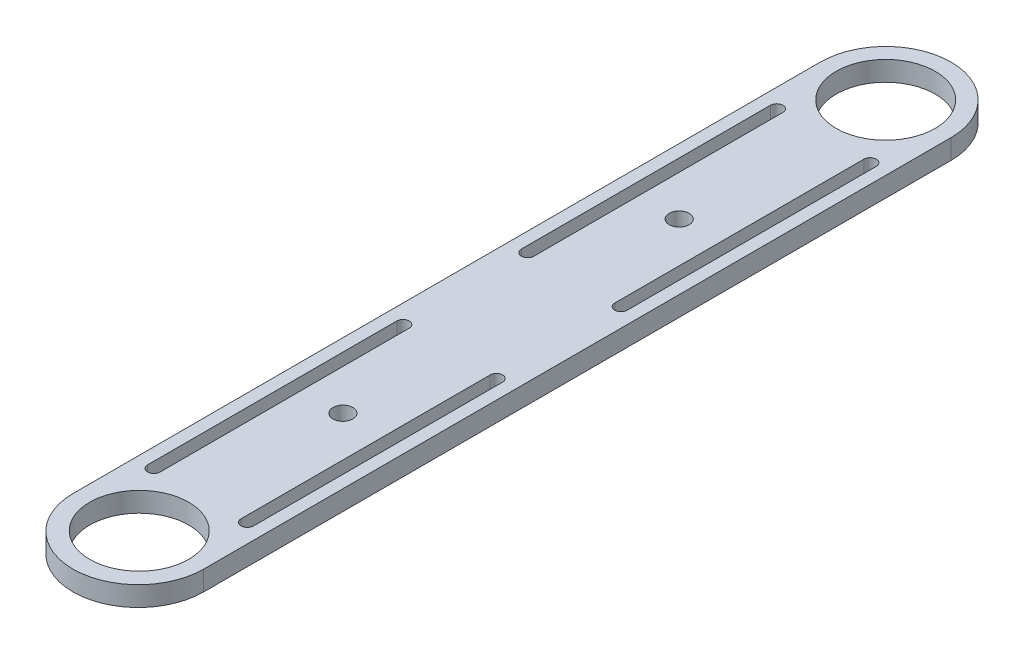
ISO-10303-21;
HEADER;
FILE_DESCRIPTION(('STEP AP214'),'2;1');
FILE_NAME('part.step','',(''),(''),'','','');
FILE_SCHEMA(('AUTOMOTIVE_DESIGN { 1 0 10303 214 1 1 1 1 }'));
ENDSEC;
DATA;
#1=APPLICATION_CONTEXT('core data for automotive mechanical design processes');
#2=APPLICATION_PROTOCOL_DEFINITION('international standard','automotive_design',2000,#1);
#3=PRODUCT_CONTEXT('',#1,'mechanical');
#4=PRODUCT('Part','Part','',(#3));
#5=PRODUCT_RELATED_PRODUCT_CATEGORY('part','',(#4));
#6=PRODUCT_DEFINITION_FORMATION('','',#4);
#7=PRODUCT_DEFINITION_CONTEXT('part definition',#1,'design');
#8=PRODUCT_DEFINITION('design','',#6,#7);
#9=PRODUCT_DEFINITION_SHAPE('','',#8);
#10=(LENGTH_UNIT() NAMED_UNIT(*) SI_UNIT(.MILLI.,.METRE.));
#11=(NAMED_UNIT(*) PLANE_ANGLE_UNIT() SI_UNIT($,.RADIAN.));
#12=(NAMED_UNIT(*) SI_UNIT($,.STERADIAN.) SOLID_ANGLE_UNIT());
#13=UNCERTAINTY_MEASURE_WITH_UNIT(LENGTH_MEASURE(1.E-05),#10,'distance_accuracy_value','');
#14=(GEOMETRIC_REPRESENTATION_CONTEXT(3) GLOBAL_UNCERTAINTY_ASSIGNED_CONTEXT((#13)) GLOBAL_UNIT_ASSIGNED_CONTEXT((#10,
#11,#12)) REPRESENTATION_CONTEXT('',''));
#15=CARTESIAN_POINT('',(0.,0.,0.));
#16=DIRECTION('',(0.,0.,1.));
#17=DIRECTION('',(1.,0.,0.));
#18=AXIS2_PLACEMENT_3D('',#15,#16,#17);
#19=CARTESIAN_POINT('',(0.,3.175,0.));
#20=DIRECTION('',(0.,-1.,0.));
#21=DIRECTION('',(0.,0.,-1.));
#22=AXIS2_PLACEMENT_3D('',#19,#20,#21);
#23=CYLINDRICAL_SURFACE('',#22,10.5);
#24=CARTESIAN_POINT('',(0.,0.,0.));
#25=DIRECTION('',(0.,1.,0.));
#26=DIRECTION('',(0.,0.,1.));
#27=AXIS2_PLACEMENT_3D('',#24,#25,#26);
#28=CIRCLE('',#27,10.5);
#29=CARTESIAN_POINT('',(10.5,0.,0.));
#30=VERTEX_POINT('',#29);
#31=CARTESIAN_POINT('',(-10.5,0.,0.));
#32=VERTEX_POINT('',#31);
#33=EDGE_CURVE('E273',#30,#32,#28,.T.);
#34=ORIENTED_EDGE('',*,*,#33,.T.);
#35=DIRECTION('',(0.,-1.,0.));
#36=VECTOR('',#35,1.);
#37=CARTESIAN_POINT('',(-10.5,3.175,0.));
#38=LINE('',#37,#36);
#39=CARTESIAN_POINT('',(-10.5,3.175,0.));
#40=VERTEX_POINT('',#39);
#41=EDGE_CURVE('E302',#40,#32,#38,.T.);
#42=ORIENTED_EDGE('',*,*,#41,.F.);
#43=CARTESIAN_POINT('',(0.,3.175,0.));
#44=DIRECTION('',(0.,1.,0.));
#45=DIRECTION('',(0.,0.,1.));
#46=AXIS2_PLACEMENT_3D('',#43,#44,#45);
#47=CIRCLE('',#46,10.5);
#48=CARTESIAN_POINT('',(10.5,3.175,0.));
#49=VERTEX_POINT('',#48);
#50=EDGE_CURVE('E276',#49,#40,#47,.T.);
#51=ORIENTED_EDGE('',*,*,#50,.F.);
#52=DIRECTION('',(0.,-1.,0.));
#53=VECTOR('',#52,1.);
#54=CARTESIAN_POINT('',(10.5,3.175,0.));
#55=LINE('',#54,#53);
#56=EDGE_CURVE('E286',#49,#30,#55,.T.);
#57=ORIENTED_EDGE('',*,*,#56,.T.);
#58=EDGE_LOOP('',(#34,#42,#51,#57));
#59=FACE_BOUND('',#58,.T.);
#60=ADVANCED_FACE('F33',(#59),#23,.T.);
#61=CARTESIAN_POINT('',(-10.5,3.175,0.));
#62=DIRECTION('',(1.,0.,0.));
#63=DIRECTION('',(0.,0.,-1.));
#64=AXIS2_PLACEMENT_3D('',#61,#62,#63);
#65=PLANE('',#64);
#66=DIRECTION('',(0.,0.,1.));
#67=VECTOR('',#66,1.);
#68=CARTESIAN_POINT('',(-10.5,0.,0.));
#69=LINE('',#68,#67);
#70=CARTESIAN_POINT('',(-10.5,0.,120.));
#71=VERTEX_POINT('',#70);
#72=EDGE_CURVE('E289',#32,#71,#69,.T.);
#73=ORIENTED_EDGE('',*,*,#72,.T.);
#74=DIRECTION('',(0.,-1.,0.));
#75=VECTOR('',#74,1.);
#76=CARTESIAN_POINT('',(-10.5,3.175,120.));
#77=LINE('',#76,#75);
#78=CARTESIAN_POINT('',(-10.5,3.175,120.));
#79=VERTEX_POINT('',#78);
#80=EDGE_CURVE('E299',#79,#71,#77,.T.);
#81=ORIENTED_EDGE('',*,*,#80,.F.);
#82=DIRECTION('',(0.,0.,1.));
#83=VECTOR('',#82,1.);
#84=CARTESIAN_POINT('',(-10.5,3.175,0.));
#85=LINE('',#84,#83);
#86=EDGE_CURVE('E279',#40,#79,#85,.T.);
#87=ORIENTED_EDGE('',*,*,#86,.F.);
#88=ORIENTED_EDGE('',*,*,#41,.T.);
#89=EDGE_LOOP('',(#73,#81,#87,#88));
#90=FACE_BOUND('',#89,.T.);
#91=ADVANCED_FACE('F368',(#90),#65,.F.);
#92=CARTESIAN_POINT('',(0.,3.175,120.));
#93=DIRECTION('',(0.,-1.,0.));
#94=DIRECTION('',(0.,0.,-1.));
#95=AXIS2_PLACEMENT_3D('',#92,#93,#94);
#96=CYLINDRICAL_SURFACE('',#95,10.5);
#97=CARTESIAN_POINT('',(0.,0.,120.));
#98=DIRECTION('',(0.,1.,0.));
#99=DIRECTION('',(0.,0.,1.));
#100=AXIS2_PLACEMENT_3D('',#97,#98,#99);
#101=CIRCLE('',#100,10.5);
#102=CARTESIAN_POINT('',(10.5,0.,120.));
#103=VERTEX_POINT('',#102);
#104=EDGE_CURVE('E291',#71,#103,#101,.T.);
#105=ORIENTED_EDGE('',*,*,#104,.T.);
#106=DIRECTION('',(0.,-1.,0.));
#107=VECTOR('',#106,1.);
#108=CARTESIAN_POINT('',(10.5,3.175,120.));
#109=LINE('',#108,#107);
#110=CARTESIAN_POINT('',(10.5,3.175,120.));
#111=VERTEX_POINT('',#110);
#112=EDGE_CURVE('E296',#111,#103,#109,.T.);
#113=ORIENTED_EDGE('',*,*,#112,.F.);
#114=CARTESIAN_POINT('',(0.,3.175,120.));
#115=DIRECTION('',(0.,1.,0.));
#116=DIRECTION('',(0.,0.,1.));
#117=AXIS2_PLACEMENT_3D('',#114,#115,#116);
#118=CIRCLE('',#117,10.5);
#119=EDGE_CURVE('E282',#79,#111,#118,.T.);
#120=ORIENTED_EDGE('',*,*,#119,.F.);
#121=ORIENTED_EDGE('',*,*,#80,.T.);
#122=EDGE_LOOP('',(#105,#113,#120,#121));
#123=FACE_BOUND('',#122,.T.);
#124=ADVANCED_FACE('F373',(#123),#96,.T.);
#125=CARTESIAN_POINT('',(10.5,3.175,0.));
#126=DIRECTION('',(-1.,0.,0.));
#127=DIRECTION('',(0.,0.,1.));
#128=AXIS2_PLACEMENT_3D('',#125,#126,#127);
#129=PLANE('',#128);
#130=DIRECTION('',(0.,0.,-1.));
#131=VECTOR('',#130,1.);
#132=CARTESIAN_POINT('',(10.5,0.,0.));
#133=LINE('',#132,#131);
#134=EDGE_CURVE('E280',#103,#30,#133,.T.);
#135=ORIENTED_EDGE('',*,*,#134,.T.);
#136=ORIENTED_EDGE('',*,*,#56,.F.);
#137=DIRECTION('',(0.,0.,-1.));
#138=VECTOR('',#137,1.);
#139=CARTESIAN_POINT('',(10.5,3.175,0.));
#140=LINE('',#139,#138);
#141=EDGE_CURVE('E284',#111,#49,#140,.T.);
#142=ORIENTED_EDGE('',*,*,#141,.F.);
#143=ORIENTED_EDGE('',*,*,#112,.T.);
#144=EDGE_LOOP('',(#135,#136,#142,#143));
#145=FACE_BOUND('',#144,.T.);
#146=ADVANCED_FACE('F388',(#145),#129,.F.);
#147=CARTESIAN_POINT('',(0.,3.175,0.));
#148=DIRECTION('',(0.,1.,0.));
#149=DIRECTION('',(0.,0.,1.));
#150=AXIS2_PLACEMENT_3D('',#147,#148,#149);
#151=PLANE('',#150);
#152=CARTESIAN_POINT('',(0.,3.175,0.));
#153=DIRECTION('',(0.,1.,0.));
#154=DIRECTION('',(0.,0.,1.));
#155=AXIS2_PLACEMENT_3D('',#152,#153,#154);
#156=CIRCLE('',#155,7.95);
#157=CARTESIAN_POINT('',(0.,3.175,7.94999999999997));
#158=VERTEX_POINT('',#157);
#159=EDGE_CURVE('E486',#158,#158,#156,.T.);
#160=ORIENTED_EDGE('',*,*,#159,.F.);
#161=EDGE_LOOP('',(#160));
#162=FACE_BOUND('',#161,.T.);
#163=CARTESIAN_POINT('',(-0.0032230352220719,3.175,119.850034656661));
#164=DIRECTION('',(0.,1.,0.));
#165=DIRECTION('',(0.,0.,1.));
#166=AXIS2_PLACEMENT_3D('',#163,#164,#165);
#167=CIRCLE('',#166,7.95);
#168=CARTESIAN_POINT('',(-0.0032230352220719,3.175,127.800034656661));
#169=VERTEX_POINT('',#168);
#170=EDGE_CURVE('E490',#169,#169,#167,.T.);
#171=ORIENTED_EDGE('',*,*,#170,.F.);
#172=EDGE_LOOP('',(#171));
#173=FACE_BOUND('',#172,.T.);
#174=CARTESIAN_POINT('',(0.,3.175,33.1500000000001));
#175=DIRECTION('',(0.,1.,0.));
#176=DIRECTION('',(0.,0.,1.));
#177=AXIS2_PLACEMENT_3D('',#174,#175,#176);
#178=CIRCLE('',#177,1.6);
#179=CARTESIAN_POINT('',(0.,3.175,34.7500000000001));
#180=VERTEX_POINT('',#179);
#181=EDGE_CURVE('E206',#180,#180,#178,.T.);
#182=ORIENTED_EDGE('',*,*,#181,.F.);
#183=EDGE_LOOP('',(#182));
#184=FACE_BOUND('',#183,.T.);
#185=CARTESIAN_POINT('',(0.,3.175,87.1500000000001));
#186=DIRECTION('',(0.,1.,0.));
#187=DIRECTION('',(0.,0.,1.));
#188=AXIS2_PLACEMENT_3D('',#185,#186,#187);
#189=CIRCLE('',#188,1.59999999999999);
#190=CARTESIAN_POINT('',(0.,3.175,88.7500000000001));
#191=VERTEX_POINT('',#190);
#192=EDGE_CURVE('E503',#191,#191,#189,.T.);
#193=ORIENTED_EDGE('',*,*,#192,.F.);
#194=EDGE_LOOP('',(#193));
#195=FACE_BOUND('',#194,.T.);
#196=CARTESIAN_POINT('',(-7.50000000000003,3.175,50.));
#197=DIRECTION('',(0.,-1.,0.));
#198=DIRECTION('',(0.,0.,-1.));
#199=AXIS2_PLACEMENT_3D('',#196,#197,#198);
#200=CIRCLE('',#199,0.999999999999999);
#201=CARTESIAN_POINT('',(-6.50000000000003,3.175,50.));
#202=VERTEX_POINT('',#201);
#203=CARTESIAN_POINT('',(-8.50000000000002,3.175,50.));
#204=VERTEX_POINT('',#203);
#205=EDGE_CURVE('E238',#202,#204,#200,.T.);
#206=ORIENTED_EDGE('',*,*,#205,.T.);
#207=DIRECTION('',(0.,0.,-1.));
#208=VECTOR('',#207,1.);
#209=CARTESIAN_POINT('',(-8.50000000000002,3.175,50.));
#210=LINE('',#209,#208);
#211=CARTESIAN_POINT('',(-8.50000000000002,3.175,10.));
#212=VERTEX_POINT('',#211);
#213=EDGE_CURVE('E241',#204,#212,#210,.T.);
#214=ORIENTED_EDGE('',*,*,#213,.T.);
#215=CARTESIAN_POINT('',(-7.50000000000003,3.175,10.));
#216=DIRECTION('',(0.,-1.,0.));
#217=DIRECTION('',(0.,0.,-1.));
#218=AXIS2_PLACEMENT_3D('',#215,#216,#217);
#219=CIRCLE('',#218,0.999999999999999);
#220=CARTESIAN_POINT('',(-6.50000000000003,3.175,10.));
#221=VERTEX_POINT('',#220);
#222=EDGE_CURVE('E49',#212,#221,#219,.T.);
#223=ORIENTED_EDGE('',*,*,#222,.T.);
#224=DIRECTION('',(0.,0.,1.));
#225=VECTOR('',#224,1.);
#226=CARTESIAN_POINT('',(-6.50000000000003,3.175,10.));
#227=LINE('',#226,#225);
#228=EDGE_CURVE('E245',#221,#202,#227,.T.);
#229=ORIENTED_EDGE('',*,*,#228,.T.);
#230=EDGE_LOOP('',(#206,#214,#223,#229));
#231=FACE_BOUND('',#230,.T.);
#232=CARTESIAN_POINT('',(7.49999999999997,3.175,10.));
#233=DIRECTION('',(0.,-1.,0.));
#234=DIRECTION('',(0.,0.,-1.));
#235=AXIS2_PLACEMENT_3D('',#232,#233,#234);
#236=CIRCLE('',#235,0.999999999999997);
#237=CARTESIAN_POINT('',(6.49999999999997,3.175,10.));
#238=VERTEX_POINT('',#237);
#239=CARTESIAN_POINT('',(8.49999999999997,3.175,10.));
#240=VERTEX_POINT('',#239);
#241=EDGE_CURVE('E218',#238,#240,#236,.T.);
#242=ORIENTED_EDGE('',*,*,#241,.T.);
#243=DIRECTION('',(0.,0.,1.));
#244=VECTOR('',#243,1.);
#245=CARTESIAN_POINT('',(8.49999999999997,3.175,10.));
#246=LINE('',#245,#244);
#247=CARTESIAN_POINT('',(8.49999999999997,3.175,50.));
#248=VERTEX_POINT('',#247);
#249=EDGE_CURVE('E221',#240,#248,#246,.T.);
#250=ORIENTED_EDGE('',*,*,#249,.T.);
#251=CARTESIAN_POINT('',(7.49999999999997,3.175,50.));
#252=DIRECTION('',(0.,-1.,0.));
#253=DIRECTION('',(0.,0.,-1.));
#254=AXIS2_PLACEMENT_3D('',#251,#252,#253);
#255=CIRCLE('',#254,0.999999999999999);
#256=CARTESIAN_POINT('',(6.49999999999997,3.175,50.));
#257=VERTEX_POINT('',#256);
#258=EDGE_CURVE('E225',#248,#257,#255,.T.);
#259=ORIENTED_EDGE('',*,*,#258,.T.);
#260=DIRECTION('',(0.,0.,-1.));
#261=VECTOR('',#260,1.);
#262=CARTESIAN_POINT('',(6.49999999999997,3.175,50.));
#263=LINE('',#262,#261);
#264=EDGE_CURVE('E228',#257,#238,#263,.T.);
#265=ORIENTED_EDGE('',*,*,#264,.T.);
#266=EDGE_LOOP('',(#242,#250,#259,#265));
#267=FACE_BOUND('',#266,.T.);
#268=CARTESIAN_POINT('',(7.49999999999984,3.175,110.));
#269=DIRECTION('',(0.,-1.,0.));
#270=DIRECTION('',(0.,0.,-1.));
#271=AXIS2_PLACEMENT_3D('',#268,#269,#270);
#272=CIRCLE('',#271,0.999999999999999);
#273=CARTESIAN_POINT('',(8.49999999999997,3.175,110.));
#274=VERTEX_POINT('',#273);
#275=CARTESIAN_POINT('',(6.49999999999997,3.175,110.));
#276=VERTEX_POINT('',#275);
#277=EDGE_CURVE('E179',#274,#276,#272,.T.);
#278=ORIENTED_EDGE('',*,*,#277,.T.);
#279=DIRECTION('',(0.,0.,-1.));
#280=VECTOR('',#279,1.);
#281=CARTESIAN_POINT('',(6.49999999999997,3.175,110.));
#282=LINE('',#281,#280);
#283=CARTESIAN_POINT('',(6.49999999999994,3.175,70.));
#284=VERTEX_POINT('',#283);
#285=EDGE_CURVE('E190',#276,#284,#282,.T.);
#286=ORIENTED_EDGE('',*,*,#285,.T.);
#287=CARTESIAN_POINT('',(7.49999999999994,3.175,70.0000000000001));
#288=DIRECTION('',(0.,-1.,0.));
#289=DIRECTION('',(0.,0.,-1.));
#290=AXIS2_PLACEMENT_3D('',#287,#288,#289);
#291=CIRCLE('',#290,1.00000000000001);
#292=CARTESIAN_POINT('',(8.49999999999997,3.175,70.));
#293=VERTEX_POINT('',#292);
#294=EDGE_CURVE('E195',#284,#293,#291,.T.);
#295=ORIENTED_EDGE('',*,*,#294,.T.);
#296=DIRECTION('',(0.,0.,1.));
#297=VECTOR('',#296,1.);
#298=CARTESIAN_POINT('',(8.49999999999997,3.175,70.));
#299=LINE('',#298,#297);
#300=EDGE_CURVE('E186',#293,#274,#299,.T.);
#301=ORIENTED_EDGE('',*,*,#300,.T.);
#302=EDGE_LOOP('',(#278,#286,#295,#301));
#303=FACE_BOUND('',#302,.T.);
#304=CARTESIAN_POINT('',(-7.50000000000005,3.175,70.));
#305=DIRECTION('',(0.,-1.,0.));
#306=DIRECTION('',(0.,0.,-1.));
#307=AXIS2_PLACEMENT_3D('',#304,#305,#306);
#308=CIRCLE('',#307,0.999999999999999);
#309=CARTESIAN_POINT('',(-8.50000000000002,3.175,70.));
#310=VERTEX_POINT('',#309);
#311=CARTESIAN_POINT('',(-6.50000000000003,3.175,70.));
#312=VERTEX_POINT('',#311);
#313=EDGE_CURVE('E215',#310,#312,#308,.T.);
#314=ORIENTED_EDGE('',*,*,#313,.T.);
#315=DIRECTION('',(0.,0.,1.));
#316=VECTOR('',#315,1.);
#317=CARTESIAN_POINT('',(-6.50000000000003,3.175,70.));
#318=LINE('',#317,#316);
#319=CARTESIAN_POINT('',(-6.50000000000003,3.175,110.));
#320=VERTEX_POINT('',#319);
#321=EDGE_CURVE('E258',#312,#320,#318,.T.);
#322=ORIENTED_EDGE('',*,*,#321,.T.);
#323=CARTESIAN_POINT('',(-7.50000000000016,3.175,110.));
#324=DIRECTION('',(0.,-1.,0.));
#325=DIRECTION('',(0.,0.,-1.));
#326=AXIS2_PLACEMENT_3D('',#323,#324,#325);
#327=CIRCLE('',#326,1.00000000000007);
#328=CARTESIAN_POINT('',(-8.50000000000016,3.175,110.));
#329=VERTEX_POINT('',#328);
#330=EDGE_CURVE('E113',#320,#329,#327,.T.);
#331=ORIENTED_EDGE('',*,*,#330,.T.);
#332=DIRECTION('',(0.,0.,-1.));
#333=VECTOR('',#332,1.);
#334=CARTESIAN_POINT('',(-8.50000000000016,3.175,110.));
#335=LINE('',#334,#333);
#336=EDGE_CURVE('E262',#329,#310,#335,.T.);
#337=ORIENTED_EDGE('',*,*,#336,.T.);
#338=EDGE_LOOP('',(#314,#322,#331,#337));
#339=FACE_BOUND('',#338,.T.);
#340=ORIENTED_EDGE('',*,*,#50,.T.);
#341=ORIENTED_EDGE('',*,*,#86,.T.);
#342=ORIENTED_EDGE('',*,*,#119,.T.);
#343=ORIENTED_EDGE('',*,*,#141,.T.);
#344=EDGE_LOOP('',(#340,#341,#342,#343));
#345=FACE_BOUND('',#344,.T.);
#346=ADVANCED_FACE('F197',(#162,#173,#184,#195,#231,#267,#303,#339,#345),#151,.T.);
#347=CARTESIAN_POINT('',(0.,0.,0.));
#348=DIRECTION('',(0.,1.,0.));
#349=DIRECTION('',(0.,0.,1.));
#350=AXIS2_PLACEMENT_3D('',#347,#348,#349);
#351=PLANE('',#350);
#352=CARTESIAN_POINT('',(0.,0.,0.));
#353=DIRECTION('',(0.,1.,0.));
#354=DIRECTION('',(0.,0.,1.));
#355=AXIS2_PLACEMENT_3D('',#352,#353,#354);
#356=CIRCLE('',#355,7.95);
#357=CARTESIAN_POINT('',(0.,0.,7.94999999999997));
#358=VERTEX_POINT('',#357);
#359=EDGE_CURVE('E489',#358,#358,#356,.T.);
#360=ORIENTED_EDGE('',*,*,#359,.T.);
#361=EDGE_LOOP('',(#360));
#362=FACE_BOUND('',#361,.T.);
#363=CARTESIAN_POINT('',(-0.0032230352220719,0.,119.850034656661));
#364=DIRECTION('',(0.,1.,0.));
#365=DIRECTION('',(0.,0.,1.));
#366=AXIS2_PLACEMENT_3D('',#363,#364,#365);
#367=CIRCLE('',#366,7.95);
#368=CARTESIAN_POINT('',(-0.0032230352220719,0.,127.800034656661));
#369=VERTEX_POINT('',#368);
#370=EDGE_CURVE('E491',#369,#369,#367,.T.);
#371=ORIENTED_EDGE('',*,*,#370,.T.);
#372=EDGE_LOOP('',(#371));
#373=FACE_BOUND('',#372,.T.);
#374=CARTESIAN_POINT('',(0.,0.,33.1500000000001));
#375=DIRECTION('',(0.,1.,0.));
#376=DIRECTION('',(0.,0.,1.));
#377=AXIS2_PLACEMENT_3D('',#374,#375,#376);
#378=CIRCLE('',#377,1.6);
#379=CARTESIAN_POINT('',(0.,0.,34.7500000000001));
#380=VERTEX_POINT('',#379);
#381=EDGE_CURVE('E500',#380,#380,#378,.T.);
#382=ORIENTED_EDGE('',*,*,#381,.T.);
#383=EDGE_LOOP('',(#382));
#384=FACE_BOUND('',#383,.T.);
#385=CARTESIAN_POINT('',(0.,0.,87.1500000000001));
#386=DIRECTION('',(0.,1.,0.));
#387=DIRECTION('',(0.,0.,1.));
#388=AXIS2_PLACEMENT_3D('',#385,#386,#387);
#389=CIRCLE('',#388,1.59999999999999);
#390=CARTESIAN_POINT('',(0.,0.,88.7500000000001));
#391=VERTEX_POINT('',#390);
#392=EDGE_CURVE('E499',#391,#391,#389,.T.);
#393=ORIENTED_EDGE('',*,*,#392,.T.);
#394=EDGE_LOOP('',(#393));
#395=FACE_BOUND('',#394,.T.);
#396=DIRECTION('',(0.,0.,1.));
#397=VECTOR('',#396,1.);
#398=CARTESIAN_POINT('',(-8.50000000000002,0.,0.));
#399=LINE('',#398,#397);
#400=CARTESIAN_POINT('',(-8.50000000000002,0.,10.));
#401=VERTEX_POINT('',#400);
#402=CARTESIAN_POINT('',(-8.50000000000002,0.,50.));
#403=VERTEX_POINT('',#402);
#404=EDGE_CURVE('E338',#401,#403,#399,.T.);
#405=ORIENTED_EDGE('',*,*,#404,.T.);
#406=CARTESIAN_POINT('',(-7.50000000000003,0.,50.));
#407=DIRECTION('',(0.,-1.,0.));
#408=DIRECTION('',(0.,0.,-1.));
#409=AXIS2_PLACEMENT_3D('',#406,#407,#408);
#410=CIRCLE('',#409,0.999999999999999);
#411=CARTESIAN_POINT('',(-6.50000000000003,0.,50.));
#412=VERTEX_POINT('',#411);
#413=EDGE_CURVE('E11',#403,#412,#410,.F.);
#414=ORIENTED_EDGE('',*,*,#413,.T.);
#415=DIRECTION('',(0.,0.,1.));
#416=VECTOR('',#415,1.);
#417=CARTESIAN_POINT('',(-6.50000000000003,0.,0.));
#418=LINE('',#417,#416);
#419=CARTESIAN_POINT('',(-6.50000000000003,0.,10.));
#420=VERTEX_POINT('',#419);
#421=EDGE_CURVE('E41',#412,#420,#418,.F.);
#422=ORIENTED_EDGE('',*,*,#421,.T.);
#423=CARTESIAN_POINT('',(-7.50000000000003,0.,10.));
#424=DIRECTION('',(0.,-1.,0.));
#425=DIRECTION('',(0.,0.,-1.));
#426=AXIS2_PLACEMENT_3D('',#423,#424,#425);
#427=CIRCLE('',#426,0.999999999999999);
#428=EDGE_CURVE('E341',#420,#401,#427,.F.);
#429=ORIENTED_EDGE('',*,*,#428,.T.);
#430=EDGE_LOOP('',(#405,#414,#422,#429));
#431=FACE_BOUND('',#430,.T.);
#432=DIRECTION('',(0.,0.,1.));
#433=VECTOR('',#432,1.);
#434=CARTESIAN_POINT('',(8.49999999999997,0.,0.));
#435=LINE('',#434,#433);
#436=CARTESIAN_POINT('',(8.49999999999997,0.,50.));
#437=VERTEX_POINT('',#436);
#438=CARTESIAN_POINT('',(8.49999999999997,0.,10.));
#439=VERTEX_POINT('',#438);
#440=EDGE_CURVE('E326',#437,#439,#435,.F.);
#441=ORIENTED_EDGE('',*,*,#440,.T.);
#442=CARTESIAN_POINT('',(7.49999999999997,0.,10.));
#443=DIRECTION('',(0.,-1.,0.));
#444=DIRECTION('',(0.,0.,-1.));
#445=AXIS2_PLACEMENT_3D('',#442,#443,#444);
#446=CIRCLE('',#445,0.999999999999997);
#447=CARTESIAN_POINT('',(6.49999999999997,0.,10.));
#448=VERTEX_POINT('',#447);
#449=EDGE_CURVE('E335',#439,#448,#446,.F.);
#450=ORIENTED_EDGE('',*,*,#449,.T.);
#451=DIRECTION('',(0.,0.,1.));
#452=VECTOR('',#451,1.);
#453=CARTESIAN_POINT('',(6.49999999999997,0.,0.));
#454=LINE('',#453,#452);
#455=CARTESIAN_POINT('',(6.49999999999997,0.,50.));
#456=VERTEX_POINT('',#455);
#457=EDGE_CURVE('E332',#448,#456,#454,.T.);
#458=ORIENTED_EDGE('',*,*,#457,.T.);
#459=CARTESIAN_POINT('',(7.49999999999997,0.,50.));
#460=DIRECTION('',(0.,-1.,0.));
#461=DIRECTION('',(0.,0.,-1.));
#462=AXIS2_PLACEMENT_3D('',#459,#460,#461);
#463=CIRCLE('',#462,0.999999999999999);
#464=EDGE_CURVE('E329',#456,#437,#463,.F.);
#465=ORIENTED_EDGE('',*,*,#464,.T.);
#466=EDGE_LOOP('',(#441,#450,#458,#465));
#467=FACE_BOUND('',#466,.T.);
#468=DIRECTION('',(0.,0.,1.));
#469=VECTOR('',#468,1.);
#470=CARTESIAN_POINT('',(6.49999999999994,0.,0.));
#471=LINE('',#470,#469);
#472=CARTESIAN_POINT('',(6.49999999999993,0.,70.));
#473=VERTEX_POINT('',#472);
#474=CARTESIAN_POINT('',(6.49999999999996,0.,110.));
#475=VERTEX_POINT('',#474);
#476=EDGE_CURVE('E317',#473,#475,#471,.T.);
#477=ORIENTED_EDGE('',*,*,#476,.T.);
#478=CARTESIAN_POINT('',(7.49999999999984,0.,110.));
#479=DIRECTION('',(0.,-1.,0.));
#480=DIRECTION('',(0.,0.,-1.));
#481=AXIS2_PLACEMENT_3D('',#478,#479,#480);
#482=CIRCLE('',#481,0.999999999999999);
#483=CARTESIAN_POINT('',(8.49999999999997,0.,110.));
#484=VERTEX_POINT('',#483);
#485=EDGE_CURVE('E182',#475,#484,#482,.F.);
#486=ORIENTED_EDGE('',*,*,#485,.T.);
#487=DIRECTION('',(0.,0.,1.));
#488=VECTOR('',#487,1.);
#489=CARTESIAN_POINT('',(8.49999999999997,0.,0.));
#490=LINE('',#489,#488);
#491=CARTESIAN_POINT('',(8.49999999999997,0.,70.));
#492=VERTEX_POINT('',#491);
#493=EDGE_CURVE('E322',#484,#492,#490,.F.);
#494=ORIENTED_EDGE('',*,*,#493,.T.);
#495=CARTESIAN_POINT('',(7.49999999999994,0.,70.0000000000001));
#496=DIRECTION('',(0.,-1.,0.));
#497=DIRECTION('',(0.,0.,-1.));
#498=AXIS2_PLACEMENT_3D('',#495,#496,#497);
#499=CIRCLE('',#498,1.00000000000001);
#500=EDGE_CURVE('E319',#492,#473,#499,.F.);
#501=ORIENTED_EDGE('',*,*,#500,.T.);
#502=EDGE_LOOP('',(#477,#486,#494,#501));
#503=FACE_BOUND('',#502,.T.);
#504=DIRECTION('',(0.,0.,1.));
#505=VECTOR('',#504,1.);
#506=CARTESIAN_POINT('',(-6.50000000000003,0.,0.));
#507=LINE('',#506,#505);
#508=CARTESIAN_POINT('',(-6.50000000000006,0.,110.));
#509=VERTEX_POINT('',#508);
#510=CARTESIAN_POINT('',(-6.50000000000003,0.,70.));
#511=VERTEX_POINT('',#510);
#512=EDGE_CURVE('E305',#509,#511,#507,.F.);
#513=ORIENTED_EDGE('',*,*,#512,.T.);
#514=CARTESIAN_POINT('',(-7.50000000000005,0.,70.));
#515=DIRECTION('',(0.,-1.,0.));
#516=DIRECTION('',(0.,0.,-1.));
#517=AXIS2_PLACEMENT_3D('',#514,#515,#516);
#518=CIRCLE('',#517,0.999999999999999);
#519=CARTESIAN_POINT('',(-8.50000000000002,0.,70.));
#520=VERTEX_POINT('',#519);
#521=EDGE_CURVE('E314',#511,#520,#518,.F.);
#522=ORIENTED_EDGE('',*,*,#521,.T.);
#523=DIRECTION('',(0.,0.,1.));
#524=VECTOR('',#523,1.);
#525=CARTESIAN_POINT('',(-8.50000000000002,0.,0.));
#526=LINE('',#525,#524);
#527=CARTESIAN_POINT('',(-8.50000000000009,0.,110.));
#528=VERTEX_POINT('',#527);
#529=EDGE_CURVE('E311',#520,#528,#526,.T.);
#530=ORIENTED_EDGE('',*,*,#529,.T.);
#531=CARTESIAN_POINT('',(-7.50000000000016,0.,110.));
#532=DIRECTION('',(0.,-1.,0.));
#533=DIRECTION('',(0.,0.,-1.));
#534=AXIS2_PLACEMENT_3D('',#531,#532,#533);
#535=CIRCLE('',#534,1.00000000000007);
#536=EDGE_CURVE('E308',#528,#509,#535,.F.);
#537=ORIENTED_EDGE('',*,*,#536,.T.);
#538=EDGE_LOOP('',(#513,#522,#530,#537));
#539=FACE_BOUND('',#538,.T.);
#540=ORIENTED_EDGE('',*,*,#33,.F.);
#541=ORIENTED_EDGE('',*,*,#134,.F.);
#542=ORIENTED_EDGE('',*,*,#104,.F.);
#543=ORIENTED_EDGE('',*,*,#72,.F.);
#544=EDGE_LOOP('',(#540,#541,#542,#543));
#545=FACE_BOUND('',#544,.T.);
#546=ADVANCED_FACE('F346',(#362,#373,#384,#395,#431,#467,#503,#539,#545),#351,.F.);
#547=CARTESIAN_POINT('',(-7.50000000000005,3.175,70.));
#548=DIRECTION('',(0.,-1.,0.));
#549=DIRECTION('',(0.,0.,-1.));
#550=AXIS2_PLACEMENT_3D('',#547,#548,#549);
#551=CYLINDRICAL_SURFACE('',#550,0.999999999999999);
#552=DIRECTION('',(0.,-1.,0.));
#553=VECTOR('',#552,1.);
#554=CARTESIAN_POINT('',(-6.50000000000003,3.175,70.));
#555=LINE('',#554,#553);
#556=EDGE_CURVE('E265',#312,#511,#555,.T.);
#557=ORIENTED_EDGE('',*,*,#556,.F.);
#558=ORIENTED_EDGE('',*,*,#313,.F.);
#559=DIRECTION('',(0.,-1.,0.));
#560=VECTOR('',#559,1.);
#561=CARTESIAN_POINT('',(-8.50000000000002,3.175,70.));
#562=LINE('',#561,#560);
#563=EDGE_CURVE('E269',#310,#520,#562,.T.);
#564=ORIENTED_EDGE('',*,*,#563,.T.);
#565=ORIENTED_EDGE('',*,*,#521,.F.);
#566=EDGE_LOOP('',(#557,#558,#564,#565));
#567=FACE_BOUND('',#566,.T.);
#568=ADVANCED_FACE('F399',(#567),#551,.F.);
#569=CARTESIAN_POINT('',(-8.50000000000016,3.175,110.));
#570=DIRECTION('',(-1.,0.,0.));
#571=DIRECTION('',(0.,0.,1.));
#572=AXIS2_PLACEMENT_3D('',#569,#570,#571);
#573=PLANE('',#572);
#574=ORIENTED_EDGE('',*,*,#563,.F.);
#575=ORIENTED_EDGE('',*,*,#336,.F.);
#576=DIRECTION('',(0.,-1.,0.));
#577=VECTOR('',#576,1.);
#578=CARTESIAN_POINT('',(-8.50000000000016,3.175,110.));
#579=LINE('',#578,#577);
#580=EDGE_CURVE('E266',#329,#528,#579,.T.);
#581=ORIENTED_EDGE('',*,*,#580,.T.);
#582=ORIENTED_EDGE('',*,*,#529,.F.);
#583=EDGE_LOOP('',(#574,#575,#581,#582));
#584=FACE_BOUND('',#583,.T.);
#585=ADVANCED_FACE('F406',(#584),#573,.F.);
#586=CARTESIAN_POINT('',(-7.50000000000016,3.175,110.));
#587=DIRECTION('',(0.,-1.,0.));
#588=DIRECTION('',(0.,0.,-1.));
#589=AXIS2_PLACEMENT_3D('',#586,#587,#588);
#590=CYLINDRICAL_SURFACE('',#589,1.00000000000007);
#591=ORIENTED_EDGE('',*,*,#580,.F.);
#592=ORIENTED_EDGE('',*,*,#330,.F.);
#593=DIRECTION('',(0.,-1.,0.));
#594=VECTOR('',#593,1.);
#595=CARTESIAN_POINT('',(-6.50000000000009,3.175,110.));
#596=LINE('',#595,#594);
#597=EDGE_CURVE('E270',#320,#509,#596,.T.);
#598=ORIENTED_EDGE('',*,*,#597,.T.);
#599=ORIENTED_EDGE('',*,*,#536,.F.);
#600=EDGE_LOOP('',(#591,#592,#598,#599));
#601=FACE_BOUND('',#600,.T.);
#602=ADVANCED_FACE('F411',(#601),#590,.F.);
#603=CARTESIAN_POINT('',(-6.50000000000003,3.175,70.));
#604=DIRECTION('',(1.,0.,0.));
#605=DIRECTION('',(0.,0.,-1.));
#606=AXIS2_PLACEMENT_3D('',#603,#604,#605);
#607=PLANE('',#606);
#608=ORIENTED_EDGE('',*,*,#597,.F.);
#609=ORIENTED_EDGE('',*,*,#321,.F.);
#610=ORIENTED_EDGE('',*,*,#556,.T.);
#611=ORIENTED_EDGE('',*,*,#512,.F.);
#612=EDGE_LOOP('',(#608,#609,#610,#611));
#613=FACE_BOUND('',#612,.T.);
#614=ADVANCED_FACE('F408',(#613),#607,.F.);
#615=CARTESIAN_POINT('',(7.49999999999984,3.175,110.));
#616=DIRECTION('',(0.,-1.,0.));
#617=DIRECTION('',(0.,0.,-1.));
#618=AXIS2_PLACEMENT_3D('',#615,#616,#617);
#619=CYLINDRICAL_SURFACE('',#618,0.999999999999999);
#620=DIRECTION('',(0.,-1.,0.));
#621=VECTOR('',#620,1.);
#622=CARTESIAN_POINT('',(6.49999999999997,3.175,110.));
#623=LINE('',#622,#621);
#624=EDGE_CURVE('E174',#276,#475,#623,.T.);
#625=ORIENTED_EDGE('',*,*,#624,.F.);
#626=ORIENTED_EDGE('',*,*,#277,.F.);
#627=DIRECTION('',(0.,-1.,0.));
#628=VECTOR('',#627,1.);
#629=CARTESIAN_POINT('',(8.49999999999997,3.175,110.));
#630=LINE('',#629,#628);
#631=EDGE_CURVE('E214',#274,#484,#630,.T.);
#632=ORIENTED_EDGE('',*,*,#631,.T.);
#633=ORIENTED_EDGE('',*,*,#485,.F.);
#634=EDGE_LOOP('',(#625,#626,#632,#633));
#635=FACE_BOUND('',#634,.T.);
#636=ADVANCED_FACE('F176',(#635),#619,.F.);
#637=CARTESIAN_POINT('',(8.49999999999997,3.175,70.));
#638=DIRECTION('',(1.,0.,0.));
#639=DIRECTION('',(0.,0.,-1.));
#640=AXIS2_PLACEMENT_3D('',#637,#638,#639);
#641=PLANE('',#640);
#642=ORIENTED_EDGE('',*,*,#631,.F.);
#643=ORIENTED_EDGE('',*,*,#300,.F.);
#644=DIRECTION('',(0.,-1.,0.));
#645=VECTOR('',#644,1.);
#646=CARTESIAN_POINT('',(8.49999999999997,3.175,70.));
#647=LINE('',#646,#645);
#648=EDGE_CURVE('E211',#293,#492,#647,.T.);
#649=ORIENTED_EDGE('',*,*,#648,.T.);
#650=ORIENTED_EDGE('',*,*,#493,.F.);
#651=EDGE_LOOP('',(#642,#643,#649,#650));
#652=FACE_BOUND('',#651,.T.);
#653=ADVANCED_FACE('F457',(#652),#641,.F.);
#654=CARTESIAN_POINT('',(7.49999999999994,3.175,70.0000000000001));
#655=DIRECTION('',(0.,-1.,0.));
#656=DIRECTION('',(0.,0.,-1.));
#657=AXIS2_PLACEMENT_3D('',#654,#655,#656);
#658=CYLINDRICAL_SURFACE('',#657,1.00000000000001);
#659=ORIENTED_EDGE('',*,*,#648,.F.);
#660=ORIENTED_EDGE('',*,*,#294,.F.);
#661=DIRECTION('',(0.,-1.,0.));
#662=VECTOR('',#661,1.);
#663=CARTESIAN_POINT('',(6.49999999999993,3.175,70.));
#664=LINE('',#663,#662);
#665=EDGE_CURVE('E185',#284,#473,#664,.T.);
#666=ORIENTED_EDGE('',*,*,#665,.T.);
#667=ORIENTED_EDGE('',*,*,#500,.F.);
#668=EDGE_LOOP('',(#659,#660,#666,#667));
#669=FACE_BOUND('',#668,.T.);
#670=ADVANCED_FACE('F443',(#669),#658,.F.);
#671=CARTESIAN_POINT('',(6.49999999999997,3.175,110.));
#672=DIRECTION('',(-1.,0.,0.));
#673=DIRECTION('',(0.,0.,1.));
#674=AXIS2_PLACEMENT_3D('',#671,#672,#673);
#675=PLANE('',#674);
#676=ORIENTED_EDGE('',*,*,#665,.F.);
#677=ORIENTED_EDGE('',*,*,#285,.F.);
#678=ORIENTED_EDGE('',*,*,#624,.T.);
#679=ORIENTED_EDGE('',*,*,#476,.F.);
#680=EDGE_LOOP('',(#676,#677,#678,#679));
#681=FACE_BOUND('',#680,.T.);
#682=ADVANCED_FACE('F191',(#681),#675,.F.);
#683=CARTESIAN_POINT('',(7.49999999999997,3.175,10.));
#684=DIRECTION('',(0.,-1.,0.));
#685=DIRECTION('',(0.,0.,-1.));
#686=AXIS2_PLACEMENT_3D('',#683,#684,#685);
#687=CYLINDRICAL_SURFACE('',#686,0.999999999999997);
#688=DIRECTION('',(0.,-1.,0.));
#689=VECTOR('',#688,1.);
#690=CARTESIAN_POINT('',(8.49999999999997,3.175,10.));
#691=LINE('',#690,#689);
#692=EDGE_CURVE('E231',#240,#439,#691,.T.);
#693=ORIENTED_EDGE('',*,*,#692,.F.);
#694=ORIENTED_EDGE('',*,*,#241,.F.);
#695=DIRECTION('',(0.,-1.,0.));
#696=VECTOR('',#695,1.);
#697=CARTESIAN_POINT('',(6.49999999999997,3.175,10.));
#698=LINE('',#697,#696);
#699=EDGE_CURVE('E200',#238,#448,#698,.T.);
#700=ORIENTED_EDGE('',*,*,#699,.T.);
#701=ORIENTED_EDGE('',*,*,#449,.F.);
#702=EDGE_LOOP('',(#693,#694,#700,#701));
#703=FACE_BOUND('',#702,.T.);
#704=ADVANCED_FACE('F435',(#703),#687,.F.);
#705=CARTESIAN_POINT('',(6.49999999999997,3.175,50.));
#706=DIRECTION('',(-1.,0.,0.));
#707=DIRECTION('',(0.,0.,1.));
#708=AXIS2_PLACEMENT_3D('',#705,#706,#707);
#709=PLANE('',#708);
#710=ORIENTED_EDGE('',*,*,#699,.F.);
#711=ORIENTED_EDGE('',*,*,#264,.F.);
#712=DIRECTION('',(0.,-1.,0.));
#713=VECTOR('',#712,1.);
#714=CARTESIAN_POINT('',(6.49999999999997,3.175,50.));
#715=LINE('',#714,#713);
#716=EDGE_CURVE('E203',#257,#456,#715,.T.);
#717=ORIENTED_EDGE('',*,*,#716,.T.);
#718=ORIENTED_EDGE('',*,*,#457,.F.);
#719=EDGE_LOOP('',(#710,#711,#717,#718));
#720=FACE_BOUND('',#719,.T.);
#721=ADVANCED_FACE('F429',(#720),#709,.F.);
#722=CARTESIAN_POINT('',(7.49999999999997,3.175,50.));
#723=DIRECTION('',(0.,-1.,0.));
#724=DIRECTION('',(0.,0.,-1.));
#725=AXIS2_PLACEMENT_3D('',#722,#723,#724);
#726=CYLINDRICAL_SURFACE('',#725,0.999999999999999);
#727=ORIENTED_EDGE('',*,*,#716,.F.);
#728=ORIENTED_EDGE('',*,*,#258,.F.);
#729=DIRECTION('',(0.,-1.,0.));
#730=VECTOR('',#729,1.);
#731=CARTESIAN_POINT('',(8.49999999999997,3.175,50.));
#732=LINE('',#731,#730);
#733=EDGE_CURVE('E233',#248,#437,#732,.T.);
#734=ORIENTED_EDGE('',*,*,#733,.T.);
#735=ORIENTED_EDGE('',*,*,#464,.F.);
#736=EDGE_LOOP('',(#727,#728,#734,#735));
#737=FACE_BOUND('',#736,.T.);
#738=ADVANCED_FACE('F423',(#737),#726,.F.);
#739=CARTESIAN_POINT('',(8.49999999999997,3.175,10.));
#740=DIRECTION('',(1.,0.,0.));
#741=DIRECTION('',(0.,0.,-1.));
#742=AXIS2_PLACEMENT_3D('',#739,#740,#741);
#743=PLANE('',#742);
#744=ORIENTED_EDGE('',*,*,#733,.F.);
#745=ORIENTED_EDGE('',*,*,#249,.F.);
#746=ORIENTED_EDGE('',*,*,#692,.T.);
#747=ORIENTED_EDGE('',*,*,#440,.F.);
#748=EDGE_LOOP('',(#744,#745,#746,#747));
#749=FACE_BOUND('',#748,.T.);
#750=ADVANCED_FACE('F419',(#749),#743,.F.);
#751=CARTESIAN_POINT('',(-7.50000000000003,3.175,50.));
#752=DIRECTION('',(0.,-1.,0.));
#753=DIRECTION('',(0.,0.,-1.));
#754=AXIS2_PLACEMENT_3D('',#751,#752,#753);
#755=CYLINDRICAL_SURFACE('',#754,0.999999999999999);
#756=DIRECTION('',(0.,-1.,0.));
#757=VECTOR('',#756,1.);
#758=CARTESIAN_POINT('',(-8.50000000000002,3.175,50.));
#759=LINE('',#758,#757);
#760=EDGE_CURVE('E105',#204,#403,#759,.T.);
#761=ORIENTED_EDGE('',*,*,#760,.F.);
#762=ORIENTED_EDGE('',*,*,#205,.F.);
#763=DIRECTION('',(0.,-1.,0.));
#764=VECTOR('',#763,1.);
#765=CARTESIAN_POINT('',(-6.50000000000003,3.175,50.));
#766=LINE('',#765,#764);
#767=EDGE_CURVE('E222',#202,#412,#766,.T.);
#768=ORIENTED_EDGE('',*,*,#767,.T.);
#769=ORIENTED_EDGE('',*,*,#413,.F.);
#770=EDGE_LOOP('',(#761,#762,#768,#769));
#771=FACE_BOUND('',#770,.T.);
#772=ADVANCED_FACE('F353',(#771),#755,.F.);
#773=CARTESIAN_POINT('',(-6.50000000000003,3.175,10.));
#774=DIRECTION('',(1.,0.,0.));
#775=DIRECTION('',(0.,0.,-1.));
#776=AXIS2_PLACEMENT_3D('',#773,#774,#775);
#777=PLANE('',#776);
#778=ORIENTED_EDGE('',*,*,#767,.F.);
#779=ORIENTED_EDGE('',*,*,#228,.F.);
#780=DIRECTION('',(0.,-1.,0.));
#781=VECTOR('',#780,1.);
#782=CARTESIAN_POINT('',(-6.50000000000003,3.175,10.));
#783=LINE('',#782,#781);
#784=EDGE_CURVE('E248',#221,#420,#783,.T.);
#785=ORIENTED_EDGE('',*,*,#784,.T.);
#786=ORIENTED_EDGE('',*,*,#421,.F.);
#787=EDGE_LOOP('',(#778,#779,#785,#786));
#788=FACE_BOUND('',#787,.T.);
#789=ADVANCED_FACE('F349',(#788),#777,.F.);
#790=CARTESIAN_POINT('',(-7.50000000000003,3.175,10.));
#791=DIRECTION('',(0.,-1.,0.));
#792=DIRECTION('',(0.,0.,-1.));
#793=AXIS2_PLACEMENT_3D('',#790,#791,#792);
#794=CYLINDRICAL_SURFACE('',#793,0.999999999999999);
#795=ORIENTED_EDGE('',*,*,#784,.F.);
#796=ORIENTED_EDGE('',*,*,#222,.F.);
#797=DIRECTION('',(0.,-1.,0.));
#798=VECTOR('',#797,1.);
#799=CARTESIAN_POINT('',(-8.50000000000002,3.175,10.));
#800=LINE('',#799,#798);
#801=EDGE_CURVE('E251',#212,#401,#800,.T.);
#802=ORIENTED_EDGE('',*,*,#801,.T.);
#803=ORIENTED_EDGE('',*,*,#428,.F.);
#804=EDGE_LOOP('',(#795,#796,#802,#803));
#805=FACE_BOUND('',#804,.T.);
#806=ADVANCED_FACE('F357',(#805),#794,.F.);
#807=CARTESIAN_POINT('',(-8.50000000000002,3.175,50.));
#808=DIRECTION('',(-1.,0.,0.));
#809=DIRECTION('',(0.,0.,1.));
#810=AXIS2_PLACEMENT_3D('',#807,#808,#809);
#811=PLANE('',#810);
#812=ORIENTED_EDGE('',*,*,#801,.F.);
#813=ORIENTED_EDGE('',*,*,#213,.F.);
#814=ORIENTED_EDGE('',*,*,#760,.T.);
#815=ORIENTED_EDGE('',*,*,#404,.F.);
#816=EDGE_LOOP('',(#812,#813,#814,#815));
#817=FACE_BOUND('',#816,.T.);
#818=ADVANCED_FACE('F356',(#817),#811,.F.);
#819=CARTESIAN_POINT('',(0.,0.,87.1500000000001));
#820=DIRECTION('',(0.,1.,0.));
#821=DIRECTION('',(0.,0.,1.));
#822=AXIS2_PLACEMENT_3D('',#819,#820,#821);
#823=CYLINDRICAL_SURFACE('',#822,1.59999999999999);
#824=ORIENTED_EDGE('',*,*,#192,.T.);
#825=EDGE_LOOP('',(#824));
#826=FACE_BOUND('',#825,.T.);
#827=ORIENTED_EDGE('',*,*,#392,.F.);
#828=EDGE_LOOP('',(#827));
#829=FACE_BOUND('',#828,.T.);
#830=ADVANCED_FACE('F364',(#826,#829),#823,.F.);
#831=CARTESIAN_POINT('',(0.,0.,33.1500000000001));
#832=DIRECTION('',(0.,1.,0.));
#833=DIRECTION('',(0.,0.,1.));
#834=AXIS2_PLACEMENT_3D('',#831,#832,#833);
#835=CYLINDRICAL_SURFACE('',#834,1.6);
#836=ORIENTED_EDGE('',*,*,#181,.T.);
#837=EDGE_LOOP('',(#836));
#838=FACE_BOUND('',#837,.T.);
#839=ORIENTED_EDGE('',*,*,#381,.F.);
#840=EDGE_LOOP('',(#839));
#841=FACE_BOUND('',#840,.T.);
#842=ADVANCED_FACE('F469',(#838,#841),#835,.F.);
#843=CARTESIAN_POINT('',(-0.0032230352220719,0.,119.850034656661));
#844=DIRECTION('',(0.,1.,0.));
#845=DIRECTION('',(0.,0.,1.));
#846=AXIS2_PLACEMENT_3D('',#843,#844,#845);
#847=CYLINDRICAL_SURFACE('',#846,7.95);
#848=ORIENTED_EDGE('',*,*,#170,.T.);
#849=EDGE_LOOP('',(#848));
#850=FACE_BOUND('',#849,.T.);
#851=ORIENTED_EDGE('',*,*,#370,.F.);
#852=EDGE_LOOP('',(#851));
#853=FACE_BOUND('',#852,.T.);
#854=ADVANCED_FACE('F473',(#850,#853),#847,.F.);
#855=CARTESIAN_POINT('',(0.,0.,0.));
#856=DIRECTION('',(0.,1.,0.));
#857=DIRECTION('',(0.,0.,1.));
#858=AXIS2_PLACEMENT_3D('',#855,#856,#857);
#859=CYLINDRICAL_SURFACE('',#858,7.95);
#860=ORIENTED_EDGE('',*,*,#159,.T.);
#861=EDGE_LOOP('',(#860));
#862=FACE_BOUND('',#861,.T.);
#863=ORIENTED_EDGE('',*,*,#359,.F.);
#864=EDGE_LOOP('',(#863));
#865=FACE_BOUND('',#864,.T.);
#866=ADVANCED_FACE('F477',(#862,#865),#859,.F.);
#867=CLOSED_SHELL('',(#60,#91,#124,#146,#346,#546,#568,#585,#602,#614,#636,#653,#670,#682,#704,
#721,#738,#750,#772,#789,#806,#818,#830,#842,#854,#866));
#868=MANIFOLD_SOLID_BREP('B2',#867);
#869=ADVANCED_BREP_SHAPE_REPRESENTATION('',(#18,#868),#14);
#870=SHAPE_DEFINITION_REPRESENTATION(#9,#869);
ENDSEC;
END-ISO-10303-21;
